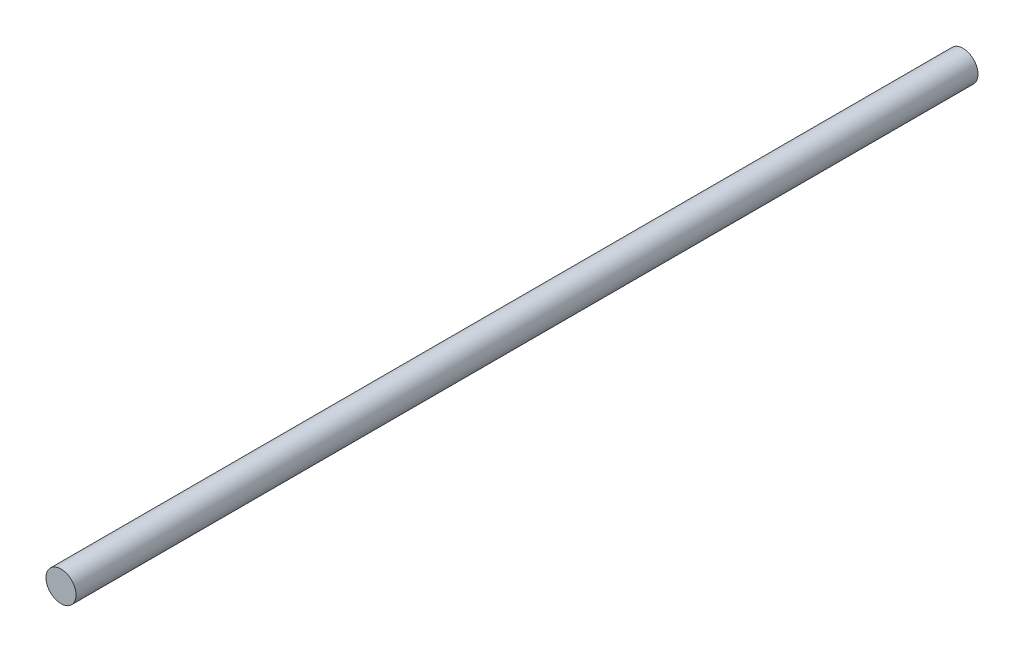
ISO-10303-21;
HEADER;
FILE_DESCRIPTION(('STEP AP214'),'2;1');
FILE_NAME('part.step','',(''),(''),'','','');
FILE_SCHEMA(('AUTOMOTIVE_DESIGN { 1 0 10303 214 1 1 1 1 }'));
ENDSEC;
DATA;
#1=APPLICATION_CONTEXT('core data for automotive mechanical design processes');
#2=APPLICATION_PROTOCOL_DEFINITION('international standard','automotive_design',2000,#1);
#3=PRODUCT_CONTEXT('',#1,'mechanical');
#4=PRODUCT('Part','Part','',(#3));
#5=PRODUCT_RELATED_PRODUCT_CATEGORY('part','',(#4));
#6=PRODUCT_DEFINITION_FORMATION('','',#4);
#7=PRODUCT_DEFINITION_CONTEXT('part definition',#1,'design');
#8=PRODUCT_DEFINITION('design','',#6,#7);
#9=PRODUCT_DEFINITION_SHAPE('','',#8);
#10=(LENGTH_UNIT() NAMED_UNIT(*) SI_UNIT(.MILLI.,.METRE.));
#11=(NAMED_UNIT(*) PLANE_ANGLE_UNIT() SI_UNIT($,.RADIAN.));
#12=(NAMED_UNIT(*) SI_UNIT($,.STERADIAN.) SOLID_ANGLE_UNIT());
#13=UNCERTAINTY_MEASURE_WITH_UNIT(LENGTH_MEASURE(1.E-05),#10,'distance_accuracy_value','');
#14=(GEOMETRIC_REPRESENTATION_CONTEXT(3) GLOBAL_UNCERTAINTY_ASSIGNED_CONTEXT((#13)) GLOBAL_UNIT_ASSIGNED_CONTEXT((#10,
#11,#12)) REPRESENTATION_CONTEXT('',''));
#15=CARTESIAN_POINT('',(0.,0.,0.));
#16=DIRECTION('',(0.,0.,1.));
#17=DIRECTION('',(1.,0.,0.));
#18=AXIS2_PLACEMENT_3D('',#15,#16,#17);
#19=CARTESIAN_POINT('',(0.,0.,600.));
#20=DIRECTION('',(0.,0.,-1.));
#21=DIRECTION('',(-1.,0.,0.));
#22=AXIS2_PLACEMENT_3D('',#19,#20,#21);
#23=CYLINDRICAL_SURFACE('',#22,10.);
#24=CARTESIAN_POINT('',(0.,0.,600.));
#25=DIRECTION('',(0.,0.,1.));
#26=DIRECTION('',(1.,0.,0.));
#27=AXIS2_PLACEMENT_3D('',#24,#25,#26);
#28=CIRCLE('',#27,10.);
#29=CARTESIAN_POINT('',(10.,0.,600.));
#30=VERTEX_POINT('',#29);
#31=EDGE_CURVE('E10',#30,#30,#28,.T.);
#32=ORIENTED_EDGE('',*,*,#31,.F.);
#33=EDGE_LOOP('',(#32));
#34=FACE_BOUND('',#33,.T.);
#35=CARTESIAN_POINT('',(0.,0.,0.));
#36=DIRECTION('',(0.,0.,1.));
#37=DIRECTION('',(1.,0.,0.));
#38=AXIS2_PLACEMENT_3D('',#35,#36,#37);
#39=CIRCLE('',#38,10.);
#40=CARTESIAN_POINT('',(10.,0.,0.));
#41=VERTEX_POINT('',#40);
#42=EDGE_CURVE('E34',#41,#41,#39,.T.);
#43=ORIENTED_EDGE('',*,*,#42,.T.);
#44=EDGE_LOOP('',(#43));
#45=FACE_BOUND('',#44,.T.);
#46=ADVANCED_FACE('F31',(#34,#45),#23,.T.);
#47=CARTESIAN_POINT('',(0.,0.,600.));
#48=DIRECTION('',(0.,0.,1.));
#49=DIRECTION('',(1.,0.,0.));
#50=AXIS2_PLACEMENT_3D('',#47,#48,#49);
#51=PLANE('',#50);
#52=ORIENTED_EDGE('',*,*,#31,.T.);
#53=EDGE_LOOP('',(#52));
#54=FACE_BOUND('',#53,.T.);
#55=ADVANCED_FACE('F46',(#54),#51,.T.);
#56=CARTESIAN_POINT('',(0.,0.,0.));
#57=DIRECTION('',(0.,0.,1.));
#58=DIRECTION('',(1.,0.,0.));
#59=AXIS2_PLACEMENT_3D('',#56,#57,#58);
#60=PLANE('',#59);
#61=ORIENTED_EDGE('',*,*,#42,.F.);
#62=EDGE_LOOP('',(#61));
#63=FACE_BOUND('',#62,.T.);
#64=ADVANCED_FACE('F44',(#63),#60,.F.);
#65=CLOSED_SHELL('',(#46,#55,#64));
#66=MANIFOLD_SOLID_BREP('B2',#65);
#67=ADVANCED_BREP_SHAPE_REPRESENTATION('',(#18,#66),#14);
#68=SHAPE_DEFINITION_REPRESENTATION(#9,#67);
ENDSEC;
END-ISO-10303-21;
